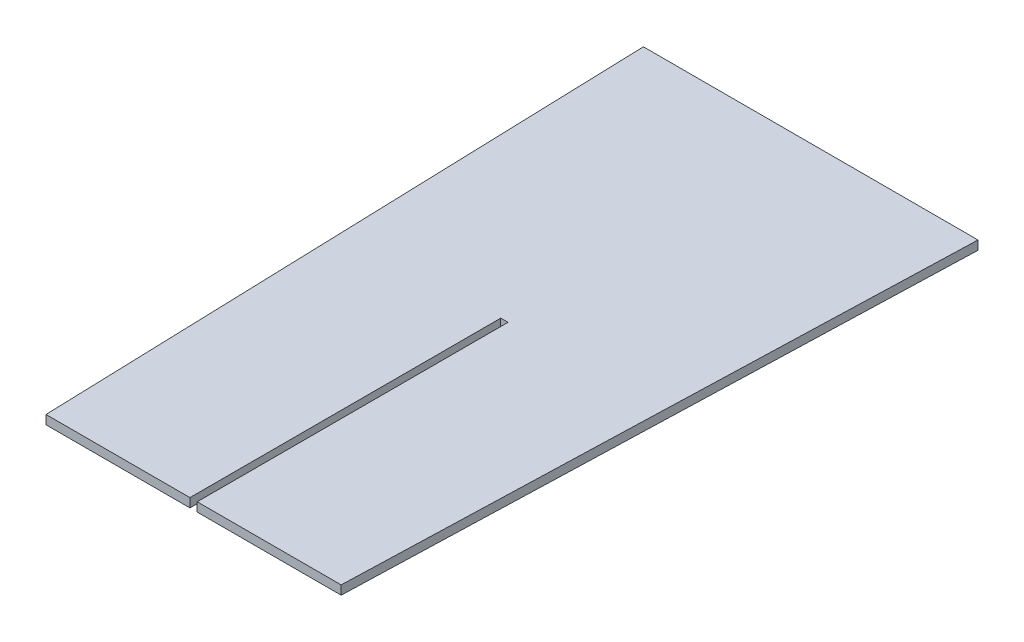
ISO-10303-21;
HEADER;
FILE_DESCRIPTION(('STEP AP214'),'2;1');
FILE_NAME('part.step','',(''),(''),'','','');
FILE_SCHEMA(('AUTOMOTIVE_DESIGN { 1 0 10303 214 1 1 1 1 }'));
ENDSEC;
DATA;
#1=APPLICATION_CONTEXT('core data for automotive mechanical design processes');
#2=APPLICATION_PROTOCOL_DEFINITION('international standard','automotive_design',2000,#1);
#3=PRODUCT_CONTEXT('',#1,'mechanical');
#4=PRODUCT('Part','Part','',(#3));
#5=PRODUCT_RELATED_PRODUCT_CATEGORY('part','',(#4));
#6=PRODUCT_DEFINITION_FORMATION('','',#4);
#7=PRODUCT_DEFINITION_CONTEXT('part definition',#1,'design');
#8=PRODUCT_DEFINITION('design','',#6,#7);
#9=PRODUCT_DEFINITION_SHAPE('','',#8);
#10=(LENGTH_UNIT() NAMED_UNIT(*) SI_UNIT(.MILLI.,.METRE.));
#11=(NAMED_UNIT(*) PLANE_ANGLE_UNIT() SI_UNIT($,.RADIAN.));
#12=(NAMED_UNIT(*) SI_UNIT($,.STERADIAN.) SOLID_ANGLE_UNIT());
#13=UNCERTAINTY_MEASURE_WITH_UNIT(LENGTH_MEASURE(1.E-05),#10,'distance_accuracy_value','');
#14=(GEOMETRIC_REPRESENTATION_CONTEXT(3) GLOBAL_UNCERTAINTY_ASSIGNED_CONTEXT((#13)) GLOBAL_UNIT_ASSIGNED_CONTEXT((#10,
#11,#12)) REPRESENTATION_CONTEXT('',''));
#15=CARTESIAN_POINT('',(0.,0.,0.));
#16=DIRECTION('',(0.,0.,1.));
#17=DIRECTION('',(1.,0.,0.));
#18=AXIS2_PLACEMENT_3D('',#15,#16,#17);
#19=CARTESIAN_POINT('',(262.6692014748,-6.35,-448.360447089144));
#20=DIRECTION('',(-0.999489318575964,0.,0.0319546874895447));
#21=DIRECTION('',(0.0319546874895447,0.,0.999489318575964));
#22=AXIS2_PLACEMENT_3D('',#19,#20,#21);
#23=PLANE('',#22);
#24=DIRECTION('',(0.0319546874895447,0.,0.999489318575964));
#25=VECTOR('',#24,1.);
#26=CARTESIAN_POINT('',(262.6692014748,0.,-448.360447089144));
#27=LINE('',#26,#25);
#28=CARTESIAN_POINT('',(262.6692014748,0.,-448.360447089144));
#29=VERTEX_POINT('',#28);
#30=CARTESIAN_POINT('',(276.6773014748,0.,-10.2104470891437));
#31=VERTEX_POINT('',#30);
#32=EDGE_CURVE('E142',#29,#31,#27,.T.);
#33=ORIENTED_EDGE('',*,*,#32,.F.);
#34=DIRECTION('',(0.,1.,0.));
#35=VECTOR('',#34,1.);
#36=CARTESIAN_POINT('',(262.6692014748,-6.35,-448.360447089144));
#37=LINE('',#36,#35);
#38=CARTESIAN_POINT('',(262.6692014748,-6.35,-448.360447089144));
#39=VERTEX_POINT('',#38);
#40=EDGE_CURVE('E11',#39,#29,#37,.T.);
#41=ORIENTED_EDGE('',*,*,#40,.F.);
#42=DIRECTION('',(0.0319546874895447,0.,0.999489318575964));
#43=VECTOR('',#42,1.);
#44=CARTESIAN_POINT('',(262.6692014748,-6.35,-448.360447089144));
#45=LINE('',#44,#43);
#46=CARTESIAN_POINT('',(276.6773014748,-6.35,-10.2104470891437));
#47=VERTEX_POINT('',#46);
#48=EDGE_CURVE('E168',#39,#47,#45,.T.);
#49=ORIENTED_EDGE('',*,*,#48,.T.);
#50=DIRECTION('',(0.,1.,0.));
#51=VECTOR('',#50,1.);
#52=CARTESIAN_POINT('',(276.6773014748,-6.35,-10.2104470891437));
#53=LINE('',#52,#51);
#54=EDGE_CURVE('E42',#47,#31,#53,.T.);
#55=ORIENTED_EDGE('',*,*,#54,.T.);
#56=EDGE_LOOP('',(#33,#41,#49,#55));
#57=FACE_BOUND('',#56,.T.);
#58=ADVANCED_FACE('F39',(#57),#23,.T.);
#59=CARTESIAN_POINT('',(262.6692014748,-6.35,-448.360447089144));
#60=DIRECTION('',(0.,0.,-1.));
#61=DIRECTION('',(-1.,0.,0.));
#62=AXIS2_PLACEMENT_3D('',#59,#60,#61);
#63=PLANE('',#62);
#64=DIRECTION('',(-1.,0.,0.));
#65=VECTOR('',#64,1.);
#66=CARTESIAN_POINT('',(262.6692014748,0.,-448.360447089144));
#67=LINE('',#66,#65);
#68=CARTESIAN_POINT('',(500.2354014748,0.,-448.360447089144));
#69=VERTEX_POINT('',#68);
#70=EDGE_CURVE('E83',#69,#29,#67,.T.);
#71=ORIENTED_EDGE('',*,*,#70,.F.);
#72=DIRECTION('',(0.,1.,0.));
#73=VECTOR('',#72,1.);
#74=CARTESIAN_POINT('',(500.2354014748,-6.35,-448.360447089144));
#75=LINE('',#74,#73);
#76=CARTESIAN_POINT('',(500.2354014748,-6.35,-448.360447089144));
#77=VERTEX_POINT('',#76);
#78=EDGE_CURVE('E49',#77,#69,#75,.T.);
#79=ORIENTED_EDGE('',*,*,#78,.F.);
#80=DIRECTION('',(-1.,0.,0.));
#81=VECTOR('',#80,1.);
#82=CARTESIAN_POINT('',(395.4413514748,-6.35,-448.360447089144));
#83=LINE('',#82,#81);
#84=EDGE_CURVE('E57',#77,#39,#83,.T.);
#85=ORIENTED_EDGE('',*,*,#84,.T.);
#86=ORIENTED_EDGE('',*,*,#40,.T.);
#87=EDGE_LOOP('',(#71,#79,#85,#86));
#88=FACE_BOUND('',#87,.T.);
#89=ADVANCED_FACE('F217',(#88),#63,.T.);
#90=CARTESIAN_POINT('',(500.2354014748,-6.35,-448.360447089144));
#91=DIRECTION('',(0.999489318575964,0.,0.0319546874895444));
#92=DIRECTION('',(0.0319546874895444,0.,-0.999489318575964));
#93=AXIS2_PLACEMENT_3D('',#90,#91,#92);
#94=PLANE('',#93);
#95=DIRECTION('',(0.0319546874895444,0.,-0.999489318575964));
#96=VECTOR('',#95,1.);
#97=CARTESIAN_POINT('',(500.2354014748,0.,-448.360447089144));
#98=LINE('',#97,#96);
#99=CARTESIAN_POINT('',(486.2273014748,0.,-10.2104470891437));
#100=VERTEX_POINT('',#99);
#101=EDGE_CURVE('E114',#100,#69,#98,.T.);
#102=ORIENTED_EDGE('',*,*,#101,.F.);
#103=DIRECTION('',(0.,1.,0.));
#104=VECTOR('',#103,1.);
#105=CARTESIAN_POINT('',(486.2273014748,-6.35,-10.2104470891437));
#106=LINE('',#105,#104);
#107=CARTESIAN_POINT('',(486.2273014748,-6.35,-10.2104470891437));
#108=VERTEX_POINT('',#107);
#109=EDGE_CURVE('E109',#108,#100,#106,.T.);
#110=ORIENTED_EDGE('',*,*,#109,.F.);
#111=DIRECTION('',(0.0319546874895444,0.,-0.999489318575964));
#112=VECTOR('',#111,1.);
#113=CARTESIAN_POINT('',(500.2354014748,-6.35,-448.360447089144));
#114=LINE('',#113,#112);
#115=EDGE_CURVE('E112',#108,#77,#114,.T.);
#116=ORIENTED_EDGE('',*,*,#115,.T.);
#117=ORIENTED_EDGE('',*,*,#78,.T.);
#118=EDGE_LOOP('',(#102,#110,#116,#117));
#119=FACE_BOUND('',#118,.T.);
#120=ADVANCED_FACE('F111',(#119),#94,.T.);
#121=CARTESIAN_POINT('',(384.0319889748,-6.35,-10.2104470891437));
#122=DIRECTION('',(0.,0.,1.));
#123=DIRECTION('',(1.,0.,0.));
#124=AXIS2_PLACEMENT_3D('',#121,#122,#123);
#125=PLANE('',#124);
#126=DIRECTION('',(1.,0.,0.));
#127=VECTOR('',#126,1.);
#128=CARTESIAN_POINT('',(384.0319889748,0.,-10.2104470891437));
#129=LINE('',#128,#127);
#130=CARTESIAN_POINT('',(384.0319889748,0.,-10.2104470891437));
#131=VERTEX_POINT('',#130);
#132=EDGE_CURVE('E162',#131,#100,#129,.T.);
#133=ORIENTED_EDGE('',*,*,#132,.F.);
#134=DIRECTION('',(0.,1.,0.));
#135=VECTOR('',#134,1.);
#136=CARTESIAN_POINT('',(384.0319889748,-6.35,-10.2104470891437));
#137=LINE('',#136,#135);
#138=CARTESIAN_POINT('',(384.0319889748,-6.35,-10.2104470891437));
#139=VERTEX_POINT('',#138);
#140=EDGE_CURVE('E120',#139,#131,#137,.T.);
#141=ORIENTED_EDGE('',*,*,#140,.F.);
#142=DIRECTION('',(1.,0.,0.));
#143=VECTOR('',#142,1.);
#144=CARTESIAN_POINT('',(384.0319889748,-6.35,-10.2104470891437));
#145=LINE('',#144,#143);
#146=EDGE_CURVE('E127',#139,#108,#145,.T.);
#147=ORIENTED_EDGE('',*,*,#146,.T.);
#148=ORIENTED_EDGE('',*,*,#109,.T.);
#149=EDGE_LOOP('',(#133,#141,#147,#148));
#150=FACE_BOUND('',#149,.T.);
#151=ADVANCED_FACE('F131',(#150),#125,.T.);
#152=CARTESIAN_POINT('',(384.0319889748,-6.35,-10.2104470891437));
#153=DIRECTION('',(-1.,0.,0.));
#154=DIRECTION('',(0.,0.,1.));
#155=AXIS2_PLACEMENT_3D('',#152,#153,#154);
#156=PLANE('',#155);
#157=DIRECTION('',(0.,0.,1.));
#158=VECTOR('',#157,1.);
#159=CARTESIAN_POINT('',(384.0319889748,0.,-10.2104470891437));
#160=LINE('',#159,#158);
#161=CARTESIAN_POINT('',(384.0319889748,0.,-230.872947089144));
#162=VERTEX_POINT('',#161);
#163=EDGE_CURVE('E158',#162,#131,#160,.T.);
#164=ORIENTED_EDGE('',*,*,#163,.F.);
#165=DIRECTION('',(0.,1.,0.));
#166=VECTOR('',#165,1.);
#167=CARTESIAN_POINT('',(384.0319889748,-6.35,-230.872947089144));
#168=LINE('',#167,#166);
#169=CARTESIAN_POINT('',(384.0319889748,-6.35,-230.872947089144));
#170=VERTEX_POINT('',#169);
#171=EDGE_CURVE('E174',#170,#162,#168,.T.);
#172=ORIENTED_EDGE('',*,*,#171,.F.);
#173=DIRECTION('',(0.,0.,1.));
#174=VECTOR('',#173,1.);
#175=CARTESIAN_POINT('',(384.0319889748,-6.35,-10.2104470891437));
#176=LINE('',#175,#174);
#177=EDGE_CURVE('E133',#170,#139,#176,.T.);
#178=ORIENTED_EDGE('',*,*,#177,.T.);
#179=ORIENTED_EDGE('',*,*,#140,.T.);
#180=EDGE_LOOP('',(#164,#172,#178,#179));
#181=FACE_BOUND('',#180,.T.);
#182=ADVANCED_FACE('F191',(#181),#156,.T.);
#183=CARTESIAN_POINT('',(378.8726139748,-6.35,-230.872947089144));
#184=DIRECTION('',(0.,0.,1.));
#185=DIRECTION('',(1.,0.,0.));
#186=AXIS2_PLACEMENT_3D('',#183,#184,#185);
#187=PLANE('',#186);
#188=DIRECTION('',(1.,0.,0.));
#189=VECTOR('',#188,1.);
#190=CARTESIAN_POINT('',(378.8726139748,0.,-230.872947089144));
#191=LINE('',#190,#189);
#192=CARTESIAN_POINT('',(378.8726139748,0.,-230.872947089144));
#193=VERTEX_POINT('',#192);
#194=EDGE_CURVE('E154',#193,#162,#191,.T.);
#195=ORIENTED_EDGE('',*,*,#194,.F.);
#196=DIRECTION('',(0.,1.,0.));
#197=VECTOR('',#196,1.);
#198=CARTESIAN_POINT('',(378.8726139748,-6.35,-230.872947089144));
#199=LINE('',#198,#197);
#200=CARTESIAN_POINT('',(378.8726139748,-6.35,-230.872947089144));
#201=VERTEX_POINT('',#200);
#202=EDGE_CURVE('E177',#201,#193,#199,.T.);
#203=ORIENTED_EDGE('',*,*,#202,.F.);
#204=DIRECTION('',(1.,0.,0.));
#205=VECTOR('',#204,1.);
#206=CARTESIAN_POINT('',(378.8726139748,-6.35,-230.872947089144));
#207=LINE('',#206,#205);
#208=EDGE_CURVE('E136',#201,#170,#207,.T.);
#209=ORIENTED_EDGE('',*,*,#208,.T.);
#210=ORIENTED_EDGE('',*,*,#171,.T.);
#211=EDGE_LOOP('',(#195,#203,#209,#210));
#212=FACE_BOUND('',#211,.T.);
#213=ADVANCED_FACE('F197',(#212),#187,.T.);
#214=CARTESIAN_POINT('',(378.8726139748,-6.35,-10.2104470891437));
#215=DIRECTION('',(1.,0.,0.));
#216=DIRECTION('',(0.,0.,-1.));
#217=AXIS2_PLACEMENT_3D('',#214,#215,#216);
#218=PLANE('',#217);
#219=DIRECTION('',(0.,0.,-1.));
#220=VECTOR('',#219,1.);
#221=CARTESIAN_POINT('',(378.8726139748,0.,-10.2104470891437));
#222=LINE('',#221,#220);
#223=CARTESIAN_POINT('',(378.8726139748,0.,-10.2104470891437));
#224=VERTEX_POINT('',#223);
#225=EDGE_CURVE('E150',#224,#193,#222,.T.);
#226=ORIENTED_EDGE('',*,*,#225,.F.);
#227=DIRECTION('',(0.,1.,0.));
#228=VECTOR('',#227,1.);
#229=CARTESIAN_POINT('',(378.8726139748,-6.35,-10.2104470891437));
#230=LINE('',#229,#228);
#231=CARTESIAN_POINT('',(378.8726139748,-6.35,-10.2104470891437));
#232=VERTEX_POINT('',#231);
#233=EDGE_CURVE('E179',#232,#224,#230,.T.);
#234=ORIENTED_EDGE('',*,*,#233,.F.);
#235=DIRECTION('',(0.,0.,-1.));
#236=VECTOR('',#235,1.);
#237=CARTESIAN_POINT('',(378.8726139748,-6.35,-10.2104470891437));
#238=LINE('',#237,#236);
#239=EDGE_CURVE('E199',#232,#201,#238,.T.);
#240=ORIENTED_EDGE('',*,*,#239,.T.);
#241=ORIENTED_EDGE('',*,*,#202,.T.);
#242=EDGE_LOOP('',(#226,#234,#240,#241));
#243=FACE_BOUND('',#242,.T.);
#244=ADVANCED_FACE('F208',(#243),#218,.T.);
#245=CARTESIAN_POINT('',(276.6773014748,-6.35,-10.2104470891437));
#246=DIRECTION('',(0.,0.,1.));
#247=DIRECTION('',(1.,0.,0.));
#248=AXIS2_PLACEMENT_3D('',#245,#246,#247);
#249=PLANE('',#248);
#250=DIRECTION('',(1.,0.,0.));
#251=VECTOR('',#250,1.);
#252=CARTESIAN_POINT('',(276.6773014748,0.,-10.2104470891437));
#253=LINE('',#252,#251);
#254=EDGE_CURVE('E146',#31,#224,#253,.T.);
#255=ORIENTED_EDGE('',*,*,#254,.F.);
#256=ORIENTED_EDGE('',*,*,#54,.F.);
#257=DIRECTION('',(1.,0.,0.));
#258=VECTOR('',#257,1.);
#259=CARTESIAN_POINT('',(276.6773014748,-6.35,-10.2104470891437));
#260=LINE('',#259,#258);
#261=EDGE_CURVE('E201',#47,#232,#260,.T.);
#262=ORIENTED_EDGE('',*,*,#261,.T.);
#263=ORIENTED_EDGE('',*,*,#233,.T.);
#264=EDGE_LOOP('',(#255,#256,#262,#263));
#265=FACE_BOUND('',#264,.T.);
#266=ADVANCED_FACE('F185',(#265),#249,.T.);
#267=CARTESIAN_POINT('',(0.,-6.35,0.));
#268=DIRECTION('',(0.,1.,0.));
#269=DIRECTION('',(0.,0.,1.));
#270=AXIS2_PLACEMENT_3D('',#267,#268,#269);
#271=PLANE('',#270);
#272=ORIENTED_EDGE('',*,*,#48,.F.);
#273=ORIENTED_EDGE('',*,*,#84,.F.);
#274=ORIENTED_EDGE('',*,*,#115,.F.);
#275=ORIENTED_EDGE('',*,*,#146,.F.);
#276=ORIENTED_EDGE('',*,*,#177,.F.);
#277=ORIENTED_EDGE('',*,*,#208,.F.);
#278=ORIENTED_EDGE('',*,*,#239,.F.);
#279=ORIENTED_EDGE('',*,*,#261,.F.);
#280=EDGE_LOOP('',(#272,#273,#274,#275,#276,#277,#278,#279));
#281=FACE_BOUND('',#280,.T.);
#282=ADVANCED_FACE('F125',(#281),#271,.F.);
#283=CARTESIAN_POINT('',(0.,0.,0.));
#284=DIRECTION('',(0.,1.,0.));
#285=DIRECTION('',(0.,0.,1.));
#286=AXIS2_PLACEMENT_3D('',#283,#284,#285);
#287=PLANE('',#286);
#288=ORIENTED_EDGE('',*,*,#101,.T.);
#289=ORIENTED_EDGE('',*,*,#70,.T.);
#290=ORIENTED_EDGE('',*,*,#32,.T.);
#291=ORIENTED_EDGE('',*,*,#254,.T.);
#292=ORIENTED_EDGE('',*,*,#225,.T.);
#293=ORIENTED_EDGE('',*,*,#194,.T.);
#294=ORIENTED_EDGE('',*,*,#163,.T.);
#295=ORIENTED_EDGE('',*,*,#132,.T.);
#296=EDGE_LOOP('',(#288,#289,#290,#291,#292,#293,#294,#295));
#297=FACE_BOUND('',#296,.T.);
#298=ADVANCED_FACE('F187',(#297),#287,.T.);
#299=CLOSED_SHELL('',(#58,#89,#120,#151,#182,#213,#244,#266,#282,#298));
#300=MANIFOLD_SOLID_BREP('B2',#299);
#301=ADVANCED_BREP_SHAPE_REPRESENTATION('',(#18,#300),#14);
#302=SHAPE_DEFINITION_REPRESENTATION(#9,#301);
ENDSEC;
END-ISO-10303-21;
